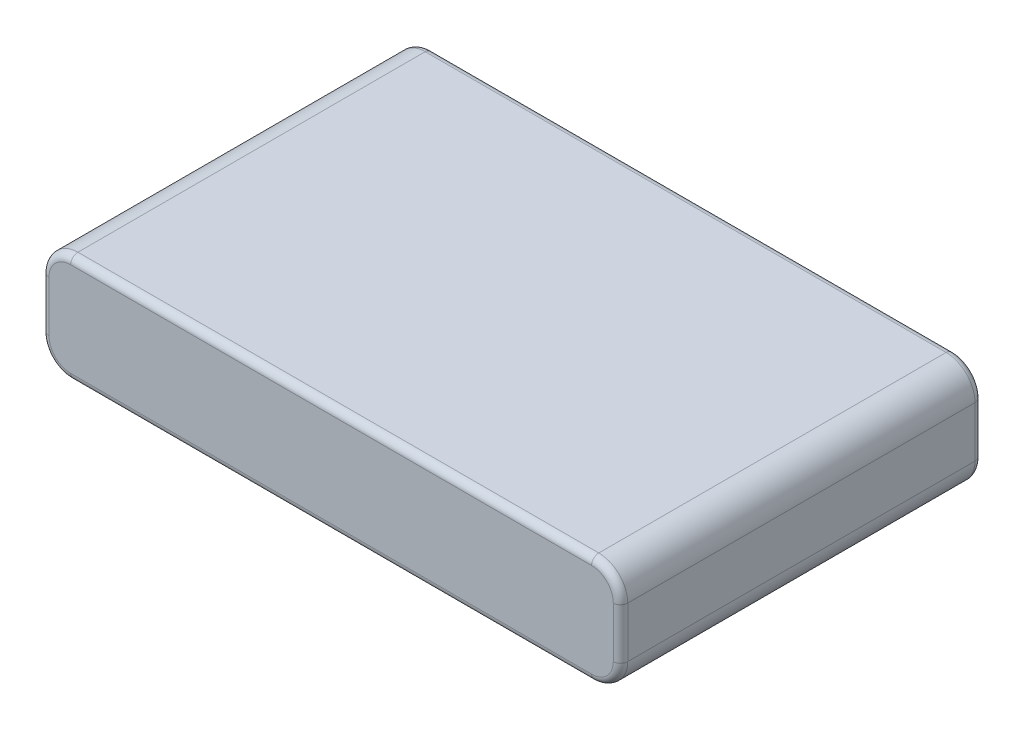
ISO-10303-21;
HEADER;
FILE_DESCRIPTION(('STEP AP214'),'2;1');
FILE_NAME('part.step','',(''),(''),'','','');
FILE_SCHEMA(('AUTOMOTIVE_DESIGN { 1 0 10303 214 1 1 1 1 }'));
ENDSEC;
DATA;
#1=APPLICATION_CONTEXT('core data for automotive mechanical design processes');
#2=APPLICATION_PROTOCOL_DEFINITION('international standard','automotive_design',2000,#1);
#3=PRODUCT_CONTEXT('',#1,'mechanical');
#4=PRODUCT('Part','Part','',(#3));
#5=PRODUCT_RELATED_PRODUCT_CATEGORY('part','',(#4));
#6=PRODUCT_DEFINITION_FORMATION('','',#4);
#7=PRODUCT_DEFINITION_CONTEXT('part definition',#1,'design');
#8=PRODUCT_DEFINITION('design','',#6,#7);
#9=PRODUCT_DEFINITION_SHAPE('','',#8);
#10=(LENGTH_UNIT() NAMED_UNIT(*) SI_UNIT(.MILLI.,.METRE.));
#11=(NAMED_UNIT(*) PLANE_ANGLE_UNIT() SI_UNIT($,.RADIAN.));
#12=(NAMED_UNIT(*) SI_UNIT($,.STERADIAN.) SOLID_ANGLE_UNIT());
#13=UNCERTAINTY_MEASURE_WITH_UNIT(LENGTH_MEASURE(1.E-05),#10,'distance_accuracy_value','');
#14=(GEOMETRIC_REPRESENTATION_CONTEXT(3) GLOBAL_UNCERTAINTY_ASSIGNED_CONTEXT((#13)) GLOBAL_UNIT_ASSIGNED_CONTEXT((#10,
#11,#12)) REPRESENTATION_CONTEXT('',''));
#15=CARTESIAN_POINT('',(0.,0.,0.));
#16=DIRECTION('',(0.,0.,1.));
#17=DIRECTION('',(1.,0.,0.));
#18=AXIS2_PLACEMENT_3D('',#15,#16,#17);
#19=CARTESIAN_POINT('',(0.,7.5,0.));
#20=DIRECTION('',(1.,0.,0.));
#21=DIRECTION('',(0.,0.,-1.));
#22=AXIS2_PLACEMENT_3D('',#19,#20,#21);
#23=PLANE('',#22);
#24=DIRECTION('',(0.,0.,1.));
#25=VECTOR('',#24,1.);
#26=CARTESIAN_POINT('',(0.,5.5,0.));
#27=LINE('',#26,#25);
#28=CARTESIAN_POINT('',(0.,5.5,-0.5));
#29=VERTEX_POINT('',#28);
#30=CARTESIAN_POINT('',(0.,5.5,-24.5));
#31=VERTEX_POINT('',#30);
#32=EDGE_CURVE('E300',#29,#31,#27,.F.);
#33=ORIENTED_EDGE('',*,*,#32,.T.);
#34=DIRECTION('',(0.,-1.,0.));
#35=VECTOR('',#34,1.);
#36=CARTESIAN_POINT('',(0.,7.5,-24.5));
#37=LINE('',#36,#35);
#38=CARTESIAN_POINT('',(0.,2.,-24.5));
#39=VERTEX_POINT('',#38);
#40=EDGE_CURVE('E255',#31,#39,#37,.T.);
#41=ORIENTED_EDGE('',*,*,#40,.T.);
#42=DIRECTION('',(0.,0.,1.));
#43=VECTOR('',#42,1.);
#44=CARTESIAN_POINT('',(0.,2.,0.));
#45=LINE('',#44,#43);
#46=CARTESIAN_POINT('',(0.,2.,-0.5));
#47=VERTEX_POINT('',#46);
#48=EDGE_CURVE('E295',#39,#47,#45,.T.);
#49=ORIENTED_EDGE('',*,*,#48,.T.);
#50=DIRECTION('',(0.,-1.,0.));
#51=VECTOR('',#50,1.);
#52=CARTESIAN_POINT('',(0.,7.5,-0.5));
#53=LINE('',#52,#51);
#54=EDGE_CURVE('E196',#47,#29,#53,.F.);
#55=ORIENTED_EDGE('',*,*,#54,.T.);
#56=EDGE_LOOP('',(#33,#41,#49,#55));
#57=FACE_BOUND('',#56,.T.);
#58=ADVANCED_FACE('F35',(#57),#23,.F.);
#59=CARTESIAN_POINT('',(0.,7.5,0.));
#60=DIRECTION('',(0.,0.,-1.));
#61=DIRECTION('',(-1.,0.,0.));
#62=AXIS2_PLACEMENT_3D('',#59,#60,#61);
#63=PLANE('',#62);
#64=DIRECTION('',(1.,0.,0.));
#65=VECTOR('',#64,1.);
#66=CARTESIAN_POINT('',(0.,7.,0.));
#67=LINE('',#66,#65);
#68=CARTESIAN_POINT('',(38.,7.,0.));
#69=VERTEX_POINT('',#68);
#70=CARTESIAN_POINT('',(2.,7.,0.));
#71=VERTEX_POINT('',#70);
#72=EDGE_CURVE('E153',#69,#71,#67,.F.);
#73=ORIENTED_EDGE('',*,*,#72,.T.);
#74=CARTESIAN_POINT('',(2.,5.5,0.));
#75=DIRECTION('',(0.,0.,-1.));
#76=DIRECTION('',(-1.,0.,0.));
#77=AXIS2_PLACEMENT_3D('',#74,#75,#76);
#78=CIRCLE('',#77,1.5);
#79=CARTESIAN_POINT('',(0.5,5.5,0.));
#80=VERTEX_POINT('',#79);
#81=EDGE_CURVE('E191',#71,#80,#78,.F.);
#82=ORIENTED_EDGE('',*,*,#81,.T.);
#83=DIRECTION('',(0.,-1.,0.));
#84=VECTOR('',#83,1.);
#85=CARTESIAN_POINT('',(0.5,7.5,0.));
#86=LINE('',#85,#84);
#87=CARTESIAN_POINT('',(0.5,2.,0.));
#88=VERTEX_POINT('',#87);
#89=EDGE_CURVE('E189',#80,#88,#86,.T.);
#90=ORIENTED_EDGE('',*,*,#89,.T.);
#91=CARTESIAN_POINT('',(2.,2.,0.));
#92=DIRECTION('',(0.,0.,-1.));
#93=DIRECTION('',(-1.,0.,0.));
#94=AXIS2_PLACEMENT_3D('',#91,#92,#93);
#95=CIRCLE('',#94,1.5);
#96=CARTESIAN_POINT('',(2.,0.5,0.));
#97=VERTEX_POINT('',#96);
#98=EDGE_CURVE('E187',#88,#97,#95,.F.);
#99=ORIENTED_EDGE('',*,*,#98,.T.);
#100=DIRECTION('',(1.,0.,0.));
#101=VECTOR('',#100,1.);
#102=CARTESIAN_POINT('',(38.,0.5,0.));
#103=LINE('',#102,#101);
#104=CARTESIAN_POINT('',(38.,0.5,0.));
#105=VERTEX_POINT('',#104);
#106=EDGE_CURVE('E185',#97,#105,#103,.T.);
#107=ORIENTED_EDGE('',*,*,#106,.T.);
#108=CARTESIAN_POINT('',(38.,2.,0.));
#109=DIRECTION('',(0.,0.,-1.));
#110=DIRECTION('',(-1.,0.,0.));
#111=AXIS2_PLACEMENT_3D('',#108,#109,#110);
#112=CIRCLE('',#111,1.5);
#113=CARTESIAN_POINT('',(39.5,2.,0.));
#114=VERTEX_POINT('',#113);
#115=EDGE_CURVE('E183',#105,#114,#112,.F.);
#116=ORIENTED_EDGE('',*,*,#115,.T.);
#117=DIRECTION('',(0.,-1.,0.));
#118=VECTOR('',#117,1.);
#119=CARTESIAN_POINT('',(39.5,7.5,0.));
#120=LINE('',#119,#118);
#121=CARTESIAN_POINT('',(39.5,5.5,0.));
#122=VERTEX_POINT('',#121);
#123=EDGE_CURVE('E156',#114,#122,#120,.F.);
#124=ORIENTED_EDGE('',*,*,#123,.T.);
#125=CARTESIAN_POINT('',(38.,5.5,0.));
#126=DIRECTION('',(0.,0.,-1.));
#127=DIRECTION('',(-1.,0.,0.));
#128=AXIS2_PLACEMENT_3D('',#125,#126,#127);
#129=CIRCLE('',#128,1.5);
#130=EDGE_CURVE('E148',#122,#69,#129,.F.);
#131=ORIENTED_EDGE('',*,*,#130,.T.);
#132=EDGE_LOOP('',(#73,#82,#90,#99,#107,#116,#124,#131));
#133=FACE_BOUND('',#132,.T.);
#134=ADVANCED_FACE('F150',(#133),#63,.F.);
#135=CARTESIAN_POINT('',(40.,7.5,0.));
#136=DIRECTION('',(-1.,0.,0.));
#137=DIRECTION('',(0.,0.,1.));
#138=AXIS2_PLACEMENT_3D('',#135,#136,#137);
#139=PLANE('',#138);
#140=DIRECTION('',(0.,0.,-1.));
#141=VECTOR('',#140,1.);
#142=CARTESIAN_POINT('',(40.,2.,-25.));
#143=LINE('',#142,#141);
#144=CARTESIAN_POINT('',(40.,2.,-0.5));
#145=VERTEX_POINT('',#144);
#146=CARTESIAN_POINT('',(40.,2.,-24.5));
#147=VERTEX_POINT('',#146);
#148=EDGE_CURVE('E306',#145,#147,#143,.T.);
#149=ORIENTED_EDGE('',*,*,#148,.T.);
#150=DIRECTION('',(0.,-1.,0.));
#151=VECTOR('',#150,1.);
#152=CARTESIAN_POINT('',(40.,7.5,-24.5));
#153=LINE('',#152,#151);
#154=CARTESIAN_POINT('',(40.,5.5,-24.5));
#155=VERTEX_POINT('',#154);
#156=EDGE_CURVE('E247',#147,#155,#153,.F.);
#157=ORIENTED_EDGE('',*,*,#156,.T.);
#158=DIRECTION('',(0.,0.,-1.));
#159=VECTOR('',#158,1.);
#160=CARTESIAN_POINT('',(40.,5.5,0.));
#161=LINE('',#160,#159);
#162=CARTESIAN_POINT('',(40.,5.5,-0.5));
#163=VERTEX_POINT('',#162);
#164=EDGE_CURVE('E309',#155,#163,#161,.F.);
#165=ORIENTED_EDGE('',*,*,#164,.T.);
#166=DIRECTION('',(0.,-1.,0.));
#167=VECTOR('',#166,1.);
#168=CARTESIAN_POINT('',(40.,7.5,-0.5));
#169=LINE('',#168,#167);
#170=EDGE_CURVE('E206',#163,#145,#169,.T.);
#171=ORIENTED_EDGE('',*,*,#170,.T.);
#172=EDGE_LOOP('',(#149,#157,#165,#171));
#173=FACE_BOUND('',#172,.T.);
#174=ADVANCED_FACE('F355',(#173),#139,.F.);
#175=CARTESIAN_POINT('',(0.,7.5,-25.));
#176=DIRECTION('',(0.,0.,1.));
#177=DIRECTION('',(1.,0.,0.));
#178=AXIS2_PLACEMENT_3D('',#175,#176,#177);
#179=PLANE('',#178);
#180=DIRECTION('',(-1.,0.,0.));
#181=VECTOR('',#180,1.);
#182=CARTESIAN_POINT('',(0.,7.,-25.));
#183=LINE('',#182,#181);
#184=CARTESIAN_POINT('',(2.,7.,-25.));
#185=VERTEX_POINT('',#184);
#186=CARTESIAN_POINT('',(38.,7.,-25.));
#187=VERTEX_POINT('',#186);
#188=EDGE_CURVE('E211',#185,#187,#183,.F.);
#189=ORIENTED_EDGE('',*,*,#188,.T.);
#190=CARTESIAN_POINT('',(38.,5.5,-25.));
#191=DIRECTION('',(0.,0.,1.));
#192=DIRECTION('',(1.,0.,0.));
#193=AXIS2_PLACEMENT_3D('',#190,#191,#192);
#194=CIRCLE('',#193,1.5);
#195=CARTESIAN_POINT('',(39.5,5.5,-25.));
#196=VERTEX_POINT('',#195);
#197=EDGE_CURVE('E241',#187,#196,#194,.F.);
#198=ORIENTED_EDGE('',*,*,#197,.T.);
#199=DIRECTION('',(0.,-1.,0.));
#200=VECTOR('',#199,1.);
#201=CARTESIAN_POINT('',(39.5,7.5,-25.));
#202=LINE('',#201,#200);
#203=CARTESIAN_POINT('',(39.5,2.,-25.));
#204=VERTEX_POINT('',#203);
#205=EDGE_CURVE('E239',#196,#204,#202,.T.);
#206=ORIENTED_EDGE('',*,*,#205,.T.);
#207=CARTESIAN_POINT('',(38.,2.,-25.));
#208=DIRECTION('',(0.,0.,1.));
#209=DIRECTION('',(1.,0.,0.));
#210=AXIS2_PLACEMENT_3D('',#207,#208,#209);
#211=CIRCLE('',#210,1.5);
#212=CARTESIAN_POINT('',(38.,0.5,-25.));
#213=VERTEX_POINT('',#212);
#214=EDGE_CURVE('E237',#204,#213,#211,.F.);
#215=ORIENTED_EDGE('',*,*,#214,.T.);
#216=DIRECTION('',(-1.,0.,0.));
#217=VECTOR('',#216,1.);
#218=CARTESIAN_POINT('',(2.,0.5,-25.));
#219=LINE('',#218,#217);
#220=CARTESIAN_POINT('',(2.,0.5,-25.));
#221=VERTEX_POINT('',#220);
#222=EDGE_CURVE('E235',#213,#221,#219,.T.);
#223=ORIENTED_EDGE('',*,*,#222,.T.);
#224=CARTESIAN_POINT('',(2.,2.,-25.));
#225=DIRECTION('',(0.,0.,1.));
#226=DIRECTION('',(1.,0.,0.));
#227=AXIS2_PLACEMENT_3D('',#224,#225,#226);
#228=CIRCLE('',#227,1.5);
#229=CARTESIAN_POINT('',(0.5,2.,-25.));
#230=VERTEX_POINT('',#229);
#231=EDGE_CURVE('E233',#221,#230,#228,.F.);
#232=ORIENTED_EDGE('',*,*,#231,.T.);
#233=DIRECTION('',(0.,-1.,0.));
#234=VECTOR('',#233,1.);
#235=CARTESIAN_POINT('',(0.5,7.5,-25.));
#236=LINE('',#235,#234);
#237=CARTESIAN_POINT('',(0.5,5.5,-25.));
#238=VERTEX_POINT('',#237);
#239=EDGE_CURVE('E231',#230,#238,#236,.F.);
#240=ORIENTED_EDGE('',*,*,#239,.T.);
#241=CARTESIAN_POINT('',(2.,5.5,-25.));
#242=DIRECTION('',(0.,0.,1.));
#243=DIRECTION('',(1.,0.,0.));
#244=AXIS2_PLACEMENT_3D('',#241,#242,#243);
#245=CIRCLE('',#244,1.5);
#246=EDGE_CURVE('E229',#238,#185,#245,.F.);
#247=ORIENTED_EDGE('',*,*,#246,.T.);
#248=EDGE_LOOP('',(#189,#198,#206,#215,#223,#232,#240,#247));
#249=FACE_BOUND('',#248,.T.);
#250=ADVANCED_FACE('F330',(#249),#179,.F.);
#251=CARTESIAN_POINT('',(0.,7.5,0.));
#252=DIRECTION('',(0.,-1.,0.));
#253=DIRECTION('',(0.,0.,-1.));
#254=AXIS2_PLACEMENT_3D('',#251,#252,#253);
#255=PLANE('',#254);
#256=DIRECTION('',(0.,0.,-1.));
#257=VECTOR('',#256,1.);
#258=CARTESIAN_POINT('',(38.,7.5,0.));
#259=LINE('',#258,#257);
#260=CARTESIAN_POINT('',(38.,7.5,-0.5));
#261=VERTEX_POINT('',#260);
#262=CARTESIAN_POINT('',(38.,7.5,-24.5));
#263=VERTEX_POINT('',#262);
#264=EDGE_CURVE('E227',#261,#263,#259,.T.);
#265=ORIENTED_EDGE('',*,*,#264,.T.);
#266=DIRECTION('',(-1.,0.,0.));
#267=VECTOR('',#266,1.);
#268=CARTESIAN_POINT('',(0.,7.5,-24.5));
#269=LINE('',#268,#267);
#270=CARTESIAN_POINT('',(2.,7.5,-24.5));
#271=VERTEX_POINT('',#270);
#272=EDGE_CURVE('E11',#263,#271,#269,.T.);
#273=ORIENTED_EDGE('',*,*,#272,.T.);
#274=DIRECTION('',(0.,0.,1.));
#275=VECTOR('',#274,1.);
#276=CARTESIAN_POINT('',(2.,7.5,0.));
#277=LINE('',#276,#275);
#278=CARTESIAN_POINT('',(2.,7.5,-0.5));
#279=VERTEX_POINT('',#278);
#280=EDGE_CURVE('E176',#271,#279,#277,.T.);
#281=ORIENTED_EDGE('',*,*,#280,.T.);
#282=DIRECTION('',(1.,0.,0.));
#283=VECTOR('',#282,1.);
#284=CARTESIAN_POINT('',(0.,7.5,-0.5));
#285=LINE('',#284,#283);
#286=EDGE_CURVE('E209',#279,#261,#285,.T.);
#287=ORIENTED_EDGE('',*,*,#286,.T.);
#288=EDGE_LOOP('',(#265,#273,#281,#287));
#289=FACE_BOUND('',#288,.T.);
#290=ADVANCED_FACE('F312',(#289),#255,.F.);
#291=CARTESIAN_POINT('',(0.,0.,0.));
#292=DIRECTION('',(0.,-1.,0.));
#293=DIRECTION('',(0.,0.,-1.));
#294=AXIS2_PLACEMENT_3D('',#291,#292,#293);
#295=PLANE('',#294);
#296=DIRECTION('',(0.,0.,1.));
#297=VECTOR('',#296,1.);
#298=CARTESIAN_POINT('',(2.,0.,-25.));
#299=LINE('',#298,#297);
#300=CARTESIAN_POINT('',(2.,0.,-0.5));
#301=VERTEX_POINT('',#300);
#302=CARTESIAN_POINT('',(2.,0.,-24.5));
#303=VERTEX_POINT('',#302);
#304=EDGE_CURVE('E178',#301,#303,#299,.F.);
#305=ORIENTED_EDGE('',*,*,#304,.T.);
#306=DIRECTION('',(-1.,0.,0.));
#307=VECTOR('',#306,1.);
#308=CARTESIAN_POINT('',(38.,0.,-24.5));
#309=LINE('',#308,#307);
#310=CARTESIAN_POINT('',(38.,0.,-24.5));
#311=VERTEX_POINT('',#310);
#312=EDGE_CURVE('E251',#303,#311,#309,.F.);
#313=ORIENTED_EDGE('',*,*,#312,.T.);
#314=DIRECTION('',(0.,0.,-1.));
#315=VECTOR('',#314,1.);
#316=CARTESIAN_POINT('',(38.,0.,0.));
#317=LINE('',#316,#315);
#318=CARTESIAN_POINT('',(38.,0.,-0.5));
#319=VERTEX_POINT('',#318);
#320=EDGE_CURVE('E304',#311,#319,#317,.F.);
#321=ORIENTED_EDGE('',*,*,#320,.T.);
#322=DIRECTION('',(1.,0.,0.));
#323=VECTOR('',#322,1.);
#324=CARTESIAN_POINT('',(2.,0.,-0.5));
#325=LINE('',#324,#323);
#326=EDGE_CURVE('E201',#319,#301,#325,.F.);
#327=ORIENTED_EDGE('',*,*,#326,.T.);
#328=EDGE_LOOP('',(#305,#313,#321,#327));
#329=FACE_BOUND('',#328,.T.);
#330=ADVANCED_FACE('F297',(#329),#295,.T.);
#331=CARTESIAN_POINT('',(38.,5.5,0.));
#332=DIRECTION('',(0.,0.,-1.));
#333=DIRECTION('',(-1.,0.,0.));
#334=AXIS2_PLACEMENT_3D('',#331,#332,#333);
#335=CYLINDRICAL_SURFACE('',#334,2.);
#336=ORIENTED_EDGE('',*,*,#164,.F.);
#337=CARTESIAN_POINT('',(38.,5.5,-24.5));
#338=DIRECTION('',(0.,0.,1.));
#339=DIRECTION('',(1.,0.,0.));
#340=AXIS2_PLACEMENT_3D('',#337,#338,#339);
#341=CIRCLE('',#340,2.);
#342=EDGE_CURVE('E244',#155,#263,#341,.T.);
#343=ORIENTED_EDGE('',*,*,#342,.T.);
#344=ORIENTED_EDGE('',*,*,#264,.F.);
#345=CARTESIAN_POINT('',(38.,5.5,-0.5));
#346=DIRECTION('',(0.,0.,-1.));
#347=DIRECTION('',(-1.,0.,0.));
#348=AXIS2_PLACEMENT_3D('',#345,#346,#347);
#349=CIRCLE('',#348,2.);
#350=EDGE_CURVE('E166',#261,#163,#349,.T.);
#351=ORIENTED_EDGE('',*,*,#350,.T.);
#352=EDGE_LOOP('',(#336,#343,#344,#351));
#353=FACE_BOUND('',#352,.T.);
#354=ADVANCED_FACE('F315',(#353),#335,.T.);
#355=CARTESIAN_POINT('',(38.,2.,0.));
#356=DIRECTION('',(0.,0.,1.));
#357=DIRECTION('',(1.,0.,0.));
#358=AXIS2_PLACEMENT_3D('',#355,#356,#357);
#359=CYLINDRICAL_SURFACE('',#358,2.);
#360=ORIENTED_EDGE('',*,*,#320,.F.);
#361=CARTESIAN_POINT('',(38.,2.,-24.5));
#362=DIRECTION('',(0.,0.,1.));
#363=DIRECTION('',(1.,0.,0.));
#364=AXIS2_PLACEMENT_3D('',#361,#362,#363);
#365=CIRCLE('',#364,2.);
#366=EDGE_CURVE('E249',#311,#147,#365,.T.);
#367=ORIENTED_EDGE('',*,*,#366,.T.);
#368=ORIENTED_EDGE('',*,*,#148,.F.);
#369=CARTESIAN_POINT('',(38.,2.,-0.5));
#370=DIRECTION('',(0.,0.,-1.));
#371=DIRECTION('',(-1.,0.,0.));
#372=AXIS2_PLACEMENT_3D('',#369,#370,#371);
#373=CIRCLE('',#372,2.);
#374=EDGE_CURVE('E203',#145,#319,#373,.T.);
#375=ORIENTED_EDGE('',*,*,#374,.T.);
#376=EDGE_LOOP('',(#360,#367,#368,#375));
#377=FACE_BOUND('',#376,.T.);
#378=ADVANCED_FACE('F361',(#377),#359,.T.);
#379=CARTESIAN_POINT('',(2.,2.,0.));
#380=DIRECTION('',(0.,0.,-1.));
#381=DIRECTION('',(-1.,0.,0.));
#382=AXIS2_PLACEMENT_3D('',#379,#380,#381);
#383=CYLINDRICAL_SURFACE('',#382,2.);
#384=ORIENTED_EDGE('',*,*,#48,.F.);
#385=CARTESIAN_POINT('',(2.,2.,-24.5));
#386=DIRECTION('',(0.,0.,1.));
#387=DIRECTION('',(1.,0.,0.));
#388=AXIS2_PLACEMENT_3D('',#385,#386,#387);
#389=CIRCLE('',#388,2.);
#390=EDGE_CURVE('E253',#39,#303,#389,.T.);
#391=ORIENTED_EDGE('',*,*,#390,.T.);
#392=ORIENTED_EDGE('',*,*,#304,.F.);
#393=CARTESIAN_POINT('',(2.,2.,-0.5));
#394=DIRECTION('',(0.,0.,-1.));
#395=DIRECTION('',(-1.,0.,0.));
#396=AXIS2_PLACEMENT_3D('',#393,#394,#395);
#397=CIRCLE('',#396,2.);
#398=EDGE_CURVE('E198',#301,#47,#397,.T.);
#399=ORIENTED_EDGE('',*,*,#398,.T.);
#400=EDGE_LOOP('',(#384,#391,#392,#399));
#401=FACE_BOUND('',#400,.T.);
#402=ADVANCED_FACE('F293',(#401),#383,.T.);
#403=CARTESIAN_POINT('',(2.,5.5,0.));
#404=DIRECTION('',(0.,0.,1.));
#405=DIRECTION('',(1.,0.,0.));
#406=AXIS2_PLACEMENT_3D('',#403,#404,#405);
#407=CYLINDRICAL_SURFACE('',#406,2.);
#408=ORIENTED_EDGE('',*,*,#280,.F.);
#409=CARTESIAN_POINT('',(2.,5.5,-24.5));
#410=DIRECTION('',(0.,0.,1.));
#411=DIRECTION('',(1.,0.,0.));
#412=AXIS2_PLACEMENT_3D('',#409,#410,#411);
#413=CIRCLE('',#412,2.);
#414=EDGE_CURVE('E44',#271,#31,#413,.T.);
#415=ORIENTED_EDGE('',*,*,#414,.T.);
#416=ORIENTED_EDGE('',*,*,#32,.F.);
#417=CARTESIAN_POINT('',(2.,5.5,-0.5));
#418=DIRECTION('',(0.,0.,-1.));
#419=DIRECTION('',(-1.,0.,0.));
#420=AXIS2_PLACEMENT_3D('',#417,#418,#419);
#421=CIRCLE('',#420,2.);
#422=EDGE_CURVE('E193',#29,#279,#421,.T.);
#423=ORIENTED_EDGE('',*,*,#422,.T.);
#424=EDGE_LOOP('',(#408,#415,#416,#423));
#425=FACE_BOUND('',#424,.T.);
#426=ADVANCED_FACE('F367',(#425),#407,.T.);
#427=CARTESIAN_POINT('',(38.,2.,-0.5));
#428=DIRECTION('',(0.,0.,-1.));
#429=DIRECTION('',(-1.,0.,0.));
#430=AXIS2_PLACEMENT_3D('',#427,#428,#429);
#431=TOROIDAL_SURFACE('',#430,1.5,0.5);
#432=CARTESIAN_POINT('',(38.,0.5,-0.5));
#433=DIRECTION('',(-1.,0.,0.));
#434=DIRECTION('',(0.,0.,1.));
#435=AXIS2_PLACEMENT_3D('',#432,#433,#434);
#436=CIRCLE('',#435,0.5);
#437=EDGE_CURVE('E221',#319,#105,#436,.T.);
#438=ORIENTED_EDGE('',*,*,#437,.F.);
#439=ORIENTED_EDGE('',*,*,#374,.F.);
#440=CARTESIAN_POINT('',(39.5,2.,-0.5));
#441=DIRECTION('',(0.,1.,0.));
#442=DIRECTION('',(0.,0.,1.));
#443=AXIS2_PLACEMENT_3D('',#440,#441,#442);
#444=CIRCLE('',#443,0.5);
#445=EDGE_CURVE('E224',#114,#145,#444,.T.);
#446=ORIENTED_EDGE('',*,*,#445,.F.);
#447=ORIENTED_EDGE('',*,*,#115,.F.);
#448=EDGE_LOOP('',(#438,#439,#446,#447));
#449=FACE_BOUND('',#448,.T.);
#450=ADVANCED_FACE('F370',(#449),#431,.T.);
#451=CARTESIAN_POINT('',(39.5,7.5,-0.5));
#452=DIRECTION('',(0.,-1.,0.));
#453=DIRECTION('',(0.,0.,-1.));
#454=AXIS2_PLACEMENT_3D('',#451,#452,#453);
#455=CYLINDRICAL_SURFACE('',#454,0.5);
#456=ORIENTED_EDGE('',*,*,#445,.T.);
#457=ORIENTED_EDGE('',*,*,#170,.F.);
#458=CARTESIAN_POINT('',(39.5,5.5,-0.5));
#459=DIRECTION('',(0.,1.,0.));
#460=DIRECTION('',(0.,0.,1.));
#461=AXIS2_PLACEMENT_3D('',#458,#459,#460);
#462=CIRCLE('',#461,0.5);
#463=EDGE_CURVE('E219',#122,#163,#462,.T.);
#464=ORIENTED_EDGE('',*,*,#463,.F.);
#465=ORIENTED_EDGE('',*,*,#123,.F.);
#466=EDGE_LOOP('',(#456,#457,#464,#465));
#467=FACE_BOUND('',#466,.T.);
#468=ADVANCED_FACE('F390',(#467),#455,.T.);
#469=CARTESIAN_POINT('',(0.,0.5,-0.5));
#470=DIRECTION('',(-1.,0.,0.));
#471=DIRECTION('',(0.,0.,1.));
#472=AXIS2_PLACEMENT_3D('',#469,#470,#471);
#473=CYLINDRICAL_SURFACE('',#472,0.5);
#474=ORIENTED_EDGE('',*,*,#437,.T.);
#475=ORIENTED_EDGE('',*,*,#106,.F.);
#476=CARTESIAN_POINT('',(2.,0.5,-0.5));
#477=DIRECTION('',(-1.,0.,0.));
#478=DIRECTION('',(0.,0.,1.));
#479=AXIS2_PLACEMENT_3D('',#476,#477,#478);
#480=CIRCLE('',#479,0.5);
#481=EDGE_CURVE('E169',#301,#97,#480,.T.);
#482=ORIENTED_EDGE('',*,*,#481,.F.);
#483=ORIENTED_EDGE('',*,*,#326,.F.);
#484=EDGE_LOOP('',(#474,#475,#482,#483));
#485=FACE_BOUND('',#484,.T.);
#486=ADVANCED_FACE('F387',(#485),#473,.T.);
#487=CARTESIAN_POINT('',(38.,5.5,-0.5));
#488=DIRECTION('',(0.,0.,-1.));
#489=DIRECTION('',(-1.,0.,0.));
#490=AXIS2_PLACEMENT_3D('',#487,#488,#489);
#491=TOROIDAL_SURFACE('',#490,1.5,0.5);
#492=ORIENTED_EDGE('',*,*,#463,.T.);
#493=ORIENTED_EDGE('',*,*,#350,.F.);
#494=CARTESIAN_POINT('',(38.,7.,-0.5));
#495=DIRECTION('',(-1.,0.,0.));
#496=DIRECTION('',(0.,0.,1.));
#497=AXIS2_PLACEMENT_3D('',#494,#495,#496);
#498=CIRCLE('',#497,0.5);
#499=EDGE_CURVE('E163',#69,#261,#498,.T.);
#500=ORIENTED_EDGE('',*,*,#499,.F.);
#501=ORIENTED_EDGE('',*,*,#130,.F.);
#502=EDGE_LOOP('',(#492,#493,#500,#501));
#503=FACE_BOUND('',#502,.T.);
#504=ADVANCED_FACE('F164',(#503),#491,.T.);
#505=CARTESIAN_POINT('',(2.,2.,-0.5));
#506=DIRECTION('',(0.,0.,-1.));
#507=DIRECTION('',(-1.,0.,0.));
#508=AXIS2_PLACEMENT_3D('',#505,#506,#507);
#509=TOROIDAL_SURFACE('',#508,1.5,0.5);
#510=ORIENTED_EDGE('',*,*,#481,.T.);
#511=ORIENTED_EDGE('',*,*,#98,.F.);
#512=CARTESIAN_POINT('',(0.5,2.,-0.5));
#513=DIRECTION('',(0.,1.,0.));
#514=DIRECTION('',(0.,0.,1.));
#515=AXIS2_PLACEMENT_3D('',#512,#513,#514);
#516=CIRCLE('',#515,0.5);
#517=EDGE_CURVE('E170',#47,#88,#516,.T.);
#518=ORIENTED_EDGE('',*,*,#517,.F.);
#519=ORIENTED_EDGE('',*,*,#398,.F.);
#520=EDGE_LOOP('',(#510,#511,#518,#519));
#521=FACE_BOUND('',#520,.T.);
#522=ADVANCED_FACE('F381',(#521),#509,.T.);
#523=CARTESIAN_POINT('',(0.,7.,-0.5));
#524=DIRECTION('',(1.,0.,0.));
#525=DIRECTION('',(0.,0.,-1.));
#526=AXIS2_PLACEMENT_3D('',#523,#524,#525);
#527=CYLINDRICAL_SURFACE('',#526,0.5);
#528=ORIENTED_EDGE('',*,*,#499,.T.);
#529=ORIENTED_EDGE('',*,*,#286,.F.);
#530=CARTESIAN_POINT('',(2.,7.,-0.5));
#531=DIRECTION('',(-1.,0.,0.));
#532=DIRECTION('',(0.,0.,1.));
#533=AXIS2_PLACEMENT_3D('',#530,#531,#532);
#534=CIRCLE('',#533,0.5);
#535=EDGE_CURVE('E174',#71,#279,#534,.T.);
#536=ORIENTED_EDGE('',*,*,#535,.F.);
#537=ORIENTED_EDGE('',*,*,#72,.F.);
#538=EDGE_LOOP('',(#528,#529,#536,#537));
#539=FACE_BOUND('',#538,.T.);
#540=ADVANCED_FACE('F172',(#539),#527,.T.);
#541=CARTESIAN_POINT('',(0.5,7.5,-0.5));
#542=DIRECTION('',(0.,-1.,0.));
#543=DIRECTION('',(0.,0.,-1.));
#544=AXIS2_PLACEMENT_3D('',#541,#542,#543);
#545=CYLINDRICAL_SURFACE('',#544,0.5);
#546=ORIENTED_EDGE('',*,*,#517,.T.);
#547=ORIENTED_EDGE('',*,*,#89,.F.);
#548=CARTESIAN_POINT('',(0.5,5.5,-0.5));
#549=DIRECTION('',(0.,1.,0.));
#550=DIRECTION('',(0.,0.,1.));
#551=AXIS2_PLACEMENT_3D('',#548,#549,#550);
#552=CIRCLE('',#551,0.5);
#553=EDGE_CURVE('E212',#29,#80,#552,.T.);
#554=ORIENTED_EDGE('',*,*,#553,.F.);
#555=ORIENTED_EDGE('',*,*,#54,.F.);
#556=EDGE_LOOP('',(#546,#547,#554,#555));
#557=FACE_BOUND('',#556,.T.);
#558=ADVANCED_FACE('F374',(#557),#545,.T.);
#559=CARTESIAN_POINT('',(2.,5.5,-0.5));
#560=DIRECTION('',(0.,0.,-1.));
#561=DIRECTION('',(-1.,0.,0.));
#562=AXIS2_PLACEMENT_3D('',#559,#560,#561);
#563=TOROIDAL_SURFACE('',#562,1.5,0.5);
#564=ORIENTED_EDGE('',*,*,#535,.T.);
#565=ORIENTED_EDGE('',*,*,#422,.F.);
#566=ORIENTED_EDGE('',*,*,#553,.T.);
#567=ORIENTED_EDGE('',*,*,#81,.F.);
#568=EDGE_LOOP('',(#564,#565,#566,#567));
#569=FACE_BOUND('',#568,.T.);
#570=ADVANCED_FACE('F371',(#569),#563,.T.);
#571=CARTESIAN_POINT('',(2.,2.,-24.5));
#572=DIRECTION('',(0.,0.,1.));
#573=DIRECTION('',(1.,0.,0.));
#574=AXIS2_PLACEMENT_3D('',#571,#572,#573);
#575=TOROIDAL_SURFACE('',#574,1.5,0.5);
#576=CARTESIAN_POINT('',(2.,0.5,-24.5));
#577=DIRECTION('',(1.,0.,0.));
#578=DIRECTION('',(0.,0.,-1.));
#579=AXIS2_PLACEMENT_3D('',#576,#577,#578);
#580=CIRCLE('',#579,0.5);
#581=EDGE_CURVE('E273',#303,#221,#580,.T.);
#582=ORIENTED_EDGE('',*,*,#581,.F.);
#583=ORIENTED_EDGE('',*,*,#390,.F.);
#584=CARTESIAN_POINT('',(0.5,2.,-24.5));
#585=DIRECTION('',(0.,1.,0.));
#586=DIRECTION('',(0.,0.,1.));
#587=AXIS2_PLACEMENT_3D('',#584,#585,#586);
#588=CIRCLE('',#587,0.5);
#589=EDGE_CURVE('E39',#230,#39,#588,.T.);
#590=ORIENTED_EDGE('',*,*,#589,.F.);
#591=ORIENTED_EDGE('',*,*,#231,.F.);
#592=EDGE_LOOP('',(#582,#583,#590,#591));
#593=FACE_BOUND('',#592,.T.);
#594=ADVANCED_FACE('F37',(#593),#575,.T.);
#595=CARTESIAN_POINT('',(0.5,7.5,-24.5));
#596=DIRECTION('',(0.,-1.,0.));
#597=DIRECTION('',(0.,0.,-1.));
#598=AXIS2_PLACEMENT_3D('',#595,#596,#597);
#599=CYLINDRICAL_SURFACE('',#598,0.5);
#600=ORIENTED_EDGE('',*,*,#589,.T.);
#601=ORIENTED_EDGE('',*,*,#40,.F.);
#602=CARTESIAN_POINT('',(0.5,5.5,-24.5));
#603=DIRECTION('',(0.,1.,0.));
#604=DIRECTION('',(0.,0.,1.));
#605=AXIS2_PLACEMENT_3D('',#602,#603,#604);
#606=CIRCLE('',#605,0.5);
#607=EDGE_CURVE('E271',#238,#31,#606,.T.);
#608=ORIENTED_EDGE('',*,*,#607,.F.);
#609=ORIENTED_EDGE('',*,*,#239,.F.);
#610=EDGE_LOOP('',(#600,#601,#608,#609));
#611=FACE_BOUND('',#610,.T.);
#612=ADVANCED_FACE('F284',(#611),#599,.T.);
#613=CARTESIAN_POINT('',(0.,0.5,-24.5));
#614=DIRECTION('',(1.,0.,0.));
#615=DIRECTION('',(0.,0.,-1.));
#616=AXIS2_PLACEMENT_3D('',#613,#614,#615);
#617=CYLINDRICAL_SURFACE('',#616,0.5);
#618=ORIENTED_EDGE('',*,*,#581,.T.);
#619=ORIENTED_EDGE('',*,*,#222,.F.);
#620=CARTESIAN_POINT('',(38.,0.5,-24.5));
#621=DIRECTION('',(1.,0.,0.));
#622=DIRECTION('',(0.,0.,-1.));
#623=AXIS2_PLACEMENT_3D('',#620,#621,#622);
#624=CIRCLE('',#623,0.5);
#625=EDGE_CURVE('E268',#311,#213,#624,.T.);
#626=ORIENTED_EDGE('',*,*,#625,.F.);
#627=ORIENTED_EDGE('',*,*,#312,.F.);
#628=EDGE_LOOP('',(#618,#619,#626,#627));
#629=FACE_BOUND('',#628,.T.);
#630=ADVANCED_FACE('F340',(#629),#617,.T.);
#631=CARTESIAN_POINT('',(2.,5.5,-24.5));
#632=DIRECTION('',(0.,0.,1.));
#633=DIRECTION('',(1.,0.,0.));
#634=AXIS2_PLACEMENT_3D('',#631,#632,#633);
#635=TOROIDAL_SURFACE('',#634,1.5,0.5);
#636=ORIENTED_EDGE('',*,*,#607,.T.);
#637=ORIENTED_EDGE('',*,*,#414,.F.);
#638=CARTESIAN_POINT('',(2.,7.,-24.5));
#639=DIRECTION('',(1.,0.,0.));
#640=DIRECTION('',(0.,0.,-1.));
#641=AXIS2_PLACEMENT_3D('',#638,#639,#640);
#642=CIRCLE('',#641,0.5);
#643=EDGE_CURVE('E265',#185,#271,#642,.T.);
#644=ORIENTED_EDGE('',*,*,#643,.F.);
#645=ORIENTED_EDGE('',*,*,#246,.F.);
#646=EDGE_LOOP('',(#636,#637,#644,#645));
#647=FACE_BOUND('',#646,.T.);
#648=ADVANCED_FACE('F337',(#647),#635,.T.);
#649=CARTESIAN_POINT('',(38.,2.,-24.5));
#650=DIRECTION('',(0.,0.,1.));
#651=DIRECTION('',(1.,0.,0.));
#652=AXIS2_PLACEMENT_3D('',#649,#650,#651);
#653=TOROIDAL_SURFACE('',#652,1.5,0.5);
#654=ORIENTED_EDGE('',*,*,#625,.T.);
#655=ORIENTED_EDGE('',*,*,#214,.F.);
#656=CARTESIAN_POINT('',(39.5,2.,-24.5));
#657=DIRECTION('',(0.,1.,0.));
#658=DIRECTION('',(0.,0.,1.));
#659=AXIS2_PLACEMENT_3D('',#656,#657,#658);
#660=CIRCLE('',#659,0.5);
#661=EDGE_CURVE('E262',#147,#204,#660,.T.);
#662=ORIENTED_EDGE('',*,*,#661,.F.);
#663=ORIENTED_EDGE('',*,*,#366,.F.);
#664=EDGE_LOOP('',(#654,#655,#662,#663));
#665=FACE_BOUND('',#664,.T.);
#666=ADVANCED_FACE('F339',(#665),#653,.T.);
#667=CARTESIAN_POINT('',(0.,7.,-24.5));
#668=DIRECTION('',(-1.,0.,0.));
#669=DIRECTION('',(0.,0.,1.));
#670=AXIS2_PLACEMENT_3D('',#667,#668,#669);
#671=CYLINDRICAL_SURFACE('',#670,0.5);
#672=ORIENTED_EDGE('',*,*,#643,.T.);
#673=ORIENTED_EDGE('',*,*,#272,.F.);
#674=CARTESIAN_POINT('',(38.,7.,-24.5));
#675=DIRECTION('',(1.,0.,0.));
#676=DIRECTION('',(0.,0.,-1.));
#677=AXIS2_PLACEMENT_3D('',#674,#675,#676);
#678=CIRCLE('',#677,0.5);
#679=EDGE_CURVE('E260',#187,#263,#678,.T.);
#680=ORIENTED_EDGE('',*,*,#679,.F.);
#681=ORIENTED_EDGE('',*,*,#188,.F.);
#682=EDGE_LOOP('',(#672,#673,#680,#681));
#683=FACE_BOUND('',#682,.T.);
#684=ADVANCED_FACE('F335',(#683),#671,.T.);
#685=CARTESIAN_POINT('',(39.5,7.5,-24.5));
#686=DIRECTION('',(0.,-1.,0.));
#687=DIRECTION('',(0.,0.,-1.));
#688=AXIS2_PLACEMENT_3D('',#685,#686,#687);
#689=CYLINDRICAL_SURFACE('',#688,0.5);
#690=ORIENTED_EDGE('',*,*,#661,.T.);
#691=ORIENTED_EDGE('',*,*,#205,.F.);
#692=CARTESIAN_POINT('',(39.5,5.5,-24.5));
#693=DIRECTION('',(0.,1.,0.));
#694=DIRECTION('',(0.,0.,1.));
#695=AXIS2_PLACEMENT_3D('',#692,#693,#694);
#696=CIRCLE('',#695,0.5);
#697=EDGE_CURVE('E258',#155,#196,#696,.T.);
#698=ORIENTED_EDGE('',*,*,#697,.F.);
#699=ORIENTED_EDGE('',*,*,#156,.F.);
#700=EDGE_LOOP('',(#690,#691,#698,#699));
#701=FACE_BOUND('',#700,.T.);
#702=ADVANCED_FACE('F326',(#701),#689,.T.);
#703=CARTESIAN_POINT('',(38.,5.5,-24.5));
#704=DIRECTION('',(0.,0.,1.));
#705=DIRECTION('',(1.,0.,0.));
#706=AXIS2_PLACEMENT_3D('',#703,#704,#705);
#707=TOROIDAL_SURFACE('',#706,1.5,0.5);
#708=ORIENTED_EDGE('',*,*,#679,.T.);
#709=ORIENTED_EDGE('',*,*,#342,.F.);
#710=ORIENTED_EDGE('',*,*,#697,.T.);
#711=ORIENTED_EDGE('',*,*,#197,.F.);
#712=EDGE_LOOP('',(#708,#709,#710,#711));
#713=FACE_BOUND('',#712,.T.);
#714=ADVANCED_FACE('F320',(#713),#707,.T.);
#715=CLOSED_SHELL('',(#58,#134,#174,#250,#290,#330,#354,#378,#402,#426,#450,#468,#486,#504,#522,
#540,#558,#570,#594,#612,#630,#648,#666,#684,#702,#714));
#716=MANIFOLD_SOLID_BREP('B2',#715);
#717=ADVANCED_BREP_SHAPE_REPRESENTATION('',(#18,#716),#14);
#718=SHAPE_DEFINITION_REPRESENTATION(#9,#717);
ENDSEC;
END-ISO-10303-21;
